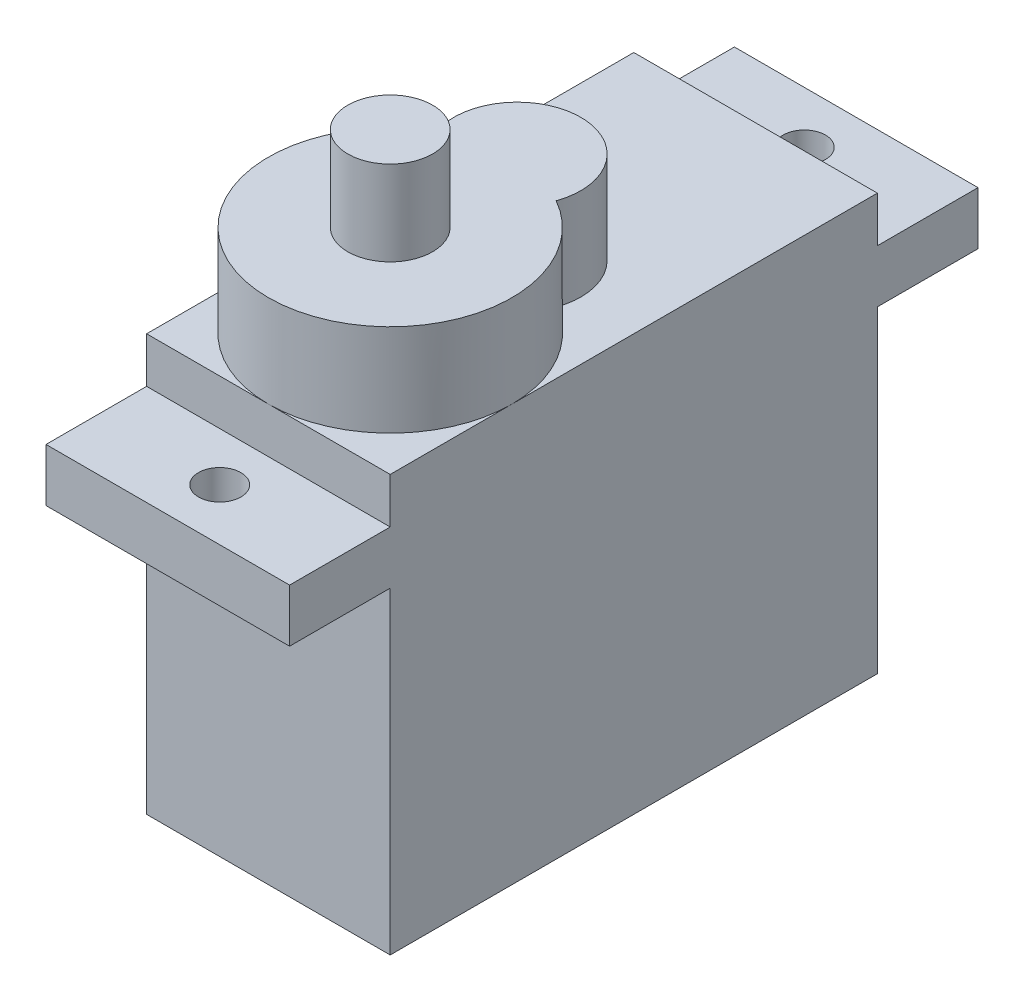
ISO-10303-21;
HEADER;
FILE_DESCRIPTION(('STEP AP214'),'2;1');
FILE_NAME('part.step','',(''),(''),'','','');
FILE_SCHEMA(('AUTOMOTIVE_DESIGN { 1 0 10303 214 1 1 1 1 }'));
ENDSEC;
DATA;
#1=APPLICATION_CONTEXT('core data for automotive mechanical design processes');
#2=APPLICATION_PROTOCOL_DEFINITION('international standard','automotive_design',2000,#1);
#3=PRODUCT_CONTEXT('',#1,'mechanical');
#4=PRODUCT('Part','Part','',(#3));
#5=PRODUCT_RELATED_PRODUCT_CATEGORY('part','',(#4));
#6=PRODUCT_DEFINITION_FORMATION('','',#4);
#7=PRODUCT_DEFINITION_CONTEXT('part definition',#1,'design');
#8=PRODUCT_DEFINITION('design','',#6,#7);
#9=PRODUCT_DEFINITION_SHAPE('','',#8);
#10=(LENGTH_UNIT() NAMED_UNIT(*) SI_UNIT(.MILLI.,.METRE.));
#11=(NAMED_UNIT(*) PLANE_ANGLE_UNIT() SI_UNIT($,.RADIAN.));
#12=(NAMED_UNIT(*) SI_UNIT($,.STERADIAN.) SOLID_ANGLE_UNIT());
#13=UNCERTAINTY_MEASURE_WITH_UNIT(LENGTH_MEASURE(1.E-05),#10,'distance_accuracy_value','');
#14=(GEOMETRIC_REPRESENTATION_CONTEXT(3) GLOBAL_UNCERTAINTY_ASSIGNED_CONTEXT((#13)) GLOBAL_UNIT_ASSIGNED_CONTEXT((#10,
#11,#12)) REPRESENTATION_CONTEXT('',''));
#15=CARTESIAN_POINT('',(0.,0.,0.));
#16=DIRECTION('',(0.,0.,1.));
#17=DIRECTION('',(1.,0.,0.));
#18=AXIS2_PLACEMENT_3D('',#15,#16,#17);
#19=CARTESIAN_POINT('',(11.5,12.15,11.5));
#20=DIRECTION('',(0.,-1.,0.));
#21=DIRECTION('',(0.,0.,-1.));
#22=AXIS2_PLACEMENT_3D('',#19,#20,#21);
#23=PLANE('',#22);
#24=CARTESIAN_POINT('',(5.75,12.15,-0.249999999999997));
#25=DIRECTION('',(0.,1.,0.));
#26=DIRECTION('',(0.,0.,1.));
#27=AXIS2_PLACEMENT_3D('',#24,#25,#26);
#28=CIRCLE('',#27,3.);
#29=CARTESIAN_POINT('',(8.58026315736373,12.15,0.744791666666667));
#30=VERTEX_POINT('',#29);
#31=CARTESIAN_POINT('',(2.91973684263626,12.15,0.74479166666667));
#32=VERTEX_POINT('',#31);
#33=EDGE_CURVE('E164',#30,#32,#28,.T.);
#34=ORIENTED_EDGE('',*,*,#33,.F.);
#35=CARTESIAN_POINT('',(5.75,12.15,5.75));
#36=DIRECTION('',(0.,1.,0.));
#37=DIRECTION('',(0.,0.,1.));
#38=AXIS2_PLACEMENT_3D('',#35,#36,#37);
#39=CIRCLE('',#38,5.75);
#40=CARTESIAN_POINT('',(11.5,12.15,5.75));
#41=VERTEX_POINT('',#40);
#42=EDGE_CURVE('E59',#41,#30,#39,.T.);
#43=ORIENTED_EDGE('',*,*,#42,.F.);
#44=DIRECTION('',(0.,0.,1.));
#45=VECTOR('',#44,1.);
#46=CARTESIAN_POINT('',(11.5,12.15,11.5));
#47=LINE('',#46,#45);
#48=CARTESIAN_POINT('',(11.5,12.15,-11.5));
#49=VERTEX_POINT('',#48);
#50=EDGE_CURVE('E185',#49,#41,#47,.T.);
#51=ORIENTED_EDGE('',*,*,#50,.F.);
#52=DIRECTION('',(-1.,0.,0.));
#53=VECTOR('',#52,1.);
#54=CARTESIAN_POINT('',(11.5,12.15,-11.5));
#55=LINE('',#54,#53);
#56=CARTESIAN_POINT('',(0.,12.15,-11.5));
#57=VERTEX_POINT('',#56);
#58=EDGE_CURVE('E243',#49,#57,#55,.T.);
#59=ORIENTED_EDGE('',*,*,#58,.T.);
#60=DIRECTION('',(0.,0.,1.));
#61=VECTOR('',#60,1.);
#62=CARTESIAN_POINT('',(0.,12.15,11.5));
#63=LINE('',#62,#61);
#64=CARTESIAN_POINT('',(0.,12.15,5.75));
#65=VERTEX_POINT('',#64);
#66=EDGE_CURVE('E209',#57,#65,#63,.T.);
#67=ORIENTED_EDGE('',*,*,#66,.T.);
#68=EDGE_CURVE('E47',#32,#65,#39,.T.);
#69=ORIENTED_EDGE('',*,*,#68,.F.);
#70=EDGE_LOOP('',(#34,#43,#51,#59,#67,#69));
#71=FACE_BOUND('',#70,.T.);
#72=ADVANCED_FACE('F36',(#71),#23,.F.);
#73=CARTESIAN_POINT('',(5.75,12.15,11.5));
#74=VERTEX_POINT('',#73);
#75=EDGE_CURVE('E11',#65,#74,#39,.T.);
#76=ORIENTED_EDGE('',*,*,#75,.F.);
#77=CARTESIAN_POINT('',(0.,12.15,11.5));
#78=VERTEX_POINT('',#77);
#79=EDGE_CURVE('E208',#65,#78,#63,.T.);
#80=ORIENTED_EDGE('',*,*,#79,.T.);
#81=DIRECTION('',(-1.,0.,0.));
#82=VECTOR('',#81,1.);
#83=CARTESIAN_POINT('',(11.5,12.15,11.5));
#84=LINE('',#83,#82);
#85=EDGE_CURVE('E239',#74,#78,#84,.T.);
#86=ORIENTED_EDGE('',*,*,#85,.F.);
#87=EDGE_LOOP('',(#76,#80,#86));
#88=FACE_BOUND('',#87,.T.);
#89=ADVANCED_FACE('F298',(#88),#23,.F.);
#90=CARTESIAN_POINT('',(11.5,7.5,-11.5));
#91=DIRECTION('',(0.,0.,1.));
#92=DIRECTION('',(0.,-1.,0.));
#93=AXIS2_PLACEMENT_3D('',#90,#91,#92);
#94=PLANE('',#93);
#95=DIRECTION('',(0.,1.,0.));
#96=VECTOR('',#95,1.);
#97=CARTESIAN_POINT('',(0.,7.5,-11.5));
#98=LINE('',#97,#96);
#99=CARTESIAN_POINT('',(0.,-7.5,-11.5));
#100=VERTEX_POINT('',#99);
#101=CARTESIAN_POINT('',(0.,7.5,-11.5));
#102=VERTEX_POINT('',#101);
#103=EDGE_CURVE('E165',#100,#102,#98,.T.);
#104=ORIENTED_EDGE('',*,*,#103,.T.);
#105=DIRECTION('',(-1.,0.,0.));
#106=VECTOR('',#105,1.);
#107=CARTESIAN_POINT('',(11.5,7.5,-11.5));
#108=LINE('',#107,#106);
#109=CARTESIAN_POINT('',(11.5,7.5,-11.5));
#110=VERTEX_POINT('',#109);
#111=EDGE_CURVE('E254',#110,#102,#108,.T.);
#112=ORIENTED_EDGE('',*,*,#111,.F.);
#113=DIRECTION('',(0.,1.,0.));
#114=VECTOR('',#113,1.);
#115=CARTESIAN_POINT('',(11.5,7.5,-11.5));
#116=LINE('',#115,#114);
#117=CARTESIAN_POINT('',(11.5,-7.5,-11.5));
#118=VERTEX_POINT('',#117);
#119=EDGE_CURVE('E172',#118,#110,#116,.T.);
#120=ORIENTED_EDGE('',*,*,#119,.F.);
#121=DIRECTION('',(-1.,0.,0.));
#122=VECTOR('',#121,1.);
#123=CARTESIAN_POINT('',(11.5,-7.5,-11.5));
#124=LINE('',#123,#122);
#125=EDGE_CURVE('E199',#118,#100,#124,.T.);
#126=ORIENTED_EDGE('',*,*,#125,.T.);
#127=EDGE_LOOP('',(#104,#112,#120,#126));
#128=FACE_BOUND('',#127,.T.);
#129=ADVANCED_FACE('F38',(#128),#94,.F.);
#130=CARTESIAN_POINT('',(11.5,7.5,-11.5));
#131=DIRECTION('',(0.,1.,0.));
#132=DIRECTION('',(0.,0.,1.));
#133=AXIS2_PLACEMENT_3D('',#130,#131,#132);
#134=PLANE('',#133);
#135=CARTESIAN_POINT('',(5.75,7.5,-13.8));
#136=DIRECTION('',(0.,1.,0.));
#137=DIRECTION('',(0.,0.,1.));
#138=AXIS2_PLACEMENT_3D('',#135,#136,#137);
#139=CIRCLE('',#138,1.);
#140=CARTESIAN_POINT('',(5.75,7.5,-12.8));
#141=VERTEX_POINT('',#140);
#142=EDGE_CURVE('E266',#141,#141,#139,.T.);
#143=ORIENTED_EDGE('',*,*,#142,.T.);
#144=EDGE_LOOP('',(#143));
#145=FACE_BOUND('',#144,.T.);
#146=DIRECTION('',(0.,0.,-1.));
#147=VECTOR('',#146,1.);
#148=CARTESIAN_POINT('',(0.,7.5,-11.5));
#149=LINE('',#148,#147);
#150=CARTESIAN_POINT('',(0.,7.5,-16.25));
#151=VERTEX_POINT('',#150);
#152=EDGE_CURVE('E168',#102,#151,#149,.T.);
#153=ORIENTED_EDGE('',*,*,#152,.T.);
#154=DIRECTION('',(-1.,0.,0.));
#155=VECTOR('',#154,1.);
#156=CARTESIAN_POINT('',(11.5,7.5,-16.25));
#157=LINE('',#156,#155);
#158=CARTESIAN_POINT('',(11.5,7.5,-16.25));
#159=VERTEX_POINT('',#158);
#160=EDGE_CURVE('E252',#159,#151,#157,.T.);
#161=ORIENTED_EDGE('',*,*,#160,.F.);
#162=DIRECTION('',(0.,0.,-1.));
#163=VECTOR('',#162,1.);
#164=CARTESIAN_POINT('',(11.5,7.5,-11.5));
#165=LINE('',#164,#163);
#166=EDGE_CURVE('E175',#110,#159,#165,.T.);
#167=ORIENTED_EDGE('',*,*,#166,.F.);
#168=ORIENTED_EDGE('',*,*,#111,.T.);
#169=EDGE_LOOP('',(#153,#161,#167,#168));
#170=FACE_BOUND('',#169,.T.);
#171=ADVANCED_FACE('F362',(#145,#170),#134,.F.);
#172=CARTESIAN_POINT('',(11.5,10.,-16.25));
#173=DIRECTION('',(0.,0.,1.));
#174=DIRECTION('',(1.,0.,0.));
#175=AXIS2_PLACEMENT_3D('',#172,#173,#174);
#176=PLANE('',#175);
#177=DIRECTION('',(0.,1.,0.));
#178=VECTOR('',#177,1.);
#179=CARTESIAN_POINT('',(0.,10.,-16.25));
#180=LINE('',#179,#178);
#181=CARTESIAN_POINT('',(0.,10.,-16.25));
#182=VERTEX_POINT('',#181);
#183=EDGE_CURVE('E202',#151,#182,#180,.T.);
#184=ORIENTED_EDGE('',*,*,#183,.T.);
#185=DIRECTION('',(-1.,0.,0.));
#186=VECTOR('',#185,1.);
#187=CARTESIAN_POINT('',(11.5,10.,-16.25));
#188=LINE('',#187,#186);
#189=CARTESIAN_POINT('',(11.5,10.,-16.25));
#190=VERTEX_POINT('',#189);
#191=EDGE_CURVE('E249',#190,#182,#188,.T.);
#192=ORIENTED_EDGE('',*,*,#191,.F.);
#193=DIRECTION('',(0.,1.,0.));
#194=VECTOR('',#193,1.);
#195=CARTESIAN_POINT('',(11.5,10.,-16.25));
#196=LINE('',#195,#194);
#197=EDGE_CURVE('E178',#159,#190,#196,.T.);
#198=ORIENTED_EDGE('',*,*,#197,.F.);
#199=ORIENTED_EDGE('',*,*,#160,.T.);
#200=EDGE_LOOP('',(#184,#192,#198,#199));
#201=FACE_BOUND('',#200,.T.);
#202=ADVANCED_FACE('F365',(#201),#176,.F.);
#203=CARTESIAN_POINT('',(11.5,10.,-11.5));
#204=DIRECTION('',(0.,-1.,0.));
#205=DIRECTION('',(0.,0.,-1.));
#206=AXIS2_PLACEMENT_3D('',#203,#204,#205);
#207=PLANE('',#206);
#208=CARTESIAN_POINT('',(5.75,10.,-13.8));
#209=DIRECTION('',(0.,1.,0.));
#210=DIRECTION('',(0.,0.,1.));
#211=AXIS2_PLACEMENT_3D('',#208,#209,#210);
#212=CIRCLE('',#211,1.);
#213=CARTESIAN_POINT('',(5.75,10.,-12.8));
#214=VERTEX_POINT('',#213);
#215=EDGE_CURVE('E270',#214,#214,#212,.T.);
#216=ORIENTED_EDGE('',*,*,#215,.F.);
#217=EDGE_LOOP('',(#216));
#218=FACE_BOUND('',#217,.T.);
#219=DIRECTION('',(0.,0.,1.));
#220=VECTOR('',#219,1.);
#221=CARTESIAN_POINT('',(0.,10.,-11.5));
#222=LINE('',#221,#220);
#223=CARTESIAN_POINT('',(0.,10.,-11.5));
#224=VERTEX_POINT('',#223);
#225=EDGE_CURVE('E204',#182,#224,#222,.T.);
#226=ORIENTED_EDGE('',*,*,#225,.T.);
#227=DIRECTION('',(-1.,0.,0.));
#228=VECTOR('',#227,1.);
#229=CARTESIAN_POINT('',(11.5,10.,-11.5));
#230=LINE('',#229,#228);
#231=CARTESIAN_POINT('',(11.5,10.,-11.5));
#232=VERTEX_POINT('',#231);
#233=EDGE_CURVE('E246',#232,#224,#230,.T.);
#234=ORIENTED_EDGE('',*,*,#233,.F.);
#235=DIRECTION('',(0.,0.,1.));
#236=VECTOR('',#235,1.);
#237=CARTESIAN_POINT('',(11.5,10.,-11.5));
#238=LINE('',#237,#236);
#239=EDGE_CURVE('E180',#190,#232,#238,.T.);
#240=ORIENTED_EDGE('',*,*,#239,.F.);
#241=ORIENTED_EDGE('',*,*,#191,.T.);
#242=EDGE_LOOP('',(#226,#234,#240,#241));
#243=FACE_BOUND('',#242,.T.);
#244=ADVANCED_FACE('F317',(#218,#243),#207,.F.);
#245=CARTESIAN_POINT('',(11.5,12.15,-11.5));
#246=DIRECTION('',(0.,0.,1.));
#247=DIRECTION('',(0.,-1.,0.));
#248=AXIS2_PLACEMENT_3D('',#245,#246,#247);
#249=PLANE('',#248);
#250=DIRECTION('',(0.,1.,0.));
#251=VECTOR('',#250,1.);
#252=CARTESIAN_POINT('',(0.,12.15,-11.5));
#253=LINE('',#252,#251);
#254=EDGE_CURVE('E206',#224,#57,#253,.T.);
#255=ORIENTED_EDGE('',*,*,#254,.T.);
#256=ORIENTED_EDGE('',*,*,#58,.F.);
#257=DIRECTION('',(0.,1.,0.));
#258=VECTOR('',#257,1.);
#259=CARTESIAN_POINT('',(11.5,12.15,-11.5));
#260=LINE('',#259,#258);
#261=EDGE_CURVE('E182',#232,#49,#260,.T.);
#262=ORIENTED_EDGE('',*,*,#261,.F.);
#263=ORIENTED_EDGE('',*,*,#233,.T.);
#264=EDGE_LOOP('',(#255,#256,#262,#263));
#265=FACE_BOUND('',#264,.T.);
#266=ADVANCED_FACE('F309',(#265),#249,.F.);
#267=EDGE_CURVE('E45',#74,#41,#39,.T.);
#268=ORIENTED_EDGE('',*,*,#267,.F.);
#269=CARTESIAN_POINT('',(11.5,12.15,11.5));
#270=VERTEX_POINT('',#269);
#271=EDGE_CURVE('E240',#270,#74,#84,.T.);
#272=ORIENTED_EDGE('',*,*,#271,.F.);
#273=EDGE_CURVE('E184',#41,#270,#47,.T.);
#274=ORIENTED_EDGE('',*,*,#273,.F.);
#275=EDGE_LOOP('',(#268,#272,#274));
#276=FACE_BOUND('',#275,.T.);
#277=ADVANCED_FACE('F300',(#276),#23,.F.);
#278=CARTESIAN_POINT('',(11.5,12.15,11.5));
#279=DIRECTION('',(0.,0.,-1.));
#280=DIRECTION('',(0.,1.,0.));
#281=AXIS2_PLACEMENT_3D('',#278,#279,#280);
#282=PLANE('',#281);
#283=DIRECTION('',(0.,-1.,0.));
#284=VECTOR('',#283,1.);
#285=CARTESIAN_POINT('',(0.,12.15,11.5));
#286=LINE('',#285,#284);
#287=CARTESIAN_POINT('',(0.,10.,11.5));
#288=VERTEX_POINT('',#287);
#289=EDGE_CURVE('E211',#78,#288,#286,.T.);
#290=ORIENTED_EDGE('',*,*,#289,.T.);
#291=DIRECTION('',(-1.,0.,0.));
#292=VECTOR('',#291,1.);
#293=CARTESIAN_POINT('',(11.5,10.,11.5));
#294=LINE('',#293,#292);
#295=CARTESIAN_POINT('',(11.5,10.,11.5));
#296=VERTEX_POINT('',#295);
#297=EDGE_CURVE('E236',#296,#288,#294,.T.);
#298=ORIENTED_EDGE('',*,*,#297,.F.);
#299=DIRECTION('',(0.,-1.,0.));
#300=VECTOR('',#299,1.);
#301=CARTESIAN_POINT('',(11.5,12.15,11.5));
#302=LINE('',#301,#300);
#303=EDGE_CURVE('E188',#270,#296,#302,.T.);
#304=ORIENTED_EDGE('',*,*,#303,.F.);
#305=ORIENTED_EDGE('',*,*,#271,.T.);
#306=ORIENTED_EDGE('',*,*,#85,.T.);
#307=EDGE_LOOP('',(#290,#298,#304,#305,#306));
#308=FACE_BOUND('',#307,.T.);
#309=ADVANCED_FACE('F308',(#308),#282,.F.);
#310=CARTESIAN_POINT('',(11.5,10.,16.25));
#311=DIRECTION('',(0.,-1.,0.));
#312=DIRECTION('',(0.,0.,-1.));
#313=AXIS2_PLACEMENT_3D('',#310,#311,#312);
#314=PLANE('',#313);
#315=CARTESIAN_POINT('',(5.75,10.,13.8));
#316=DIRECTION('',(0.,1.,0.));
#317=DIRECTION('',(0.,0.,1.));
#318=AXIS2_PLACEMENT_3D('',#315,#316,#317);
#319=CIRCLE('',#318,1.);
#320=CARTESIAN_POINT('',(5.75,10.,14.8));
#321=VERTEX_POINT('',#320);
#322=EDGE_CURVE('E273',#321,#321,#319,.T.);
#323=ORIENTED_EDGE('',*,*,#322,.F.);
#324=EDGE_LOOP('',(#323));
#325=FACE_BOUND('',#324,.T.);
#326=DIRECTION('',(0.,0.,1.));
#327=VECTOR('',#326,1.);
#328=CARTESIAN_POINT('',(0.,10.,16.25));
#329=LINE('',#328,#327);
#330=CARTESIAN_POINT('',(0.,10.,16.25));
#331=VERTEX_POINT('',#330);
#332=EDGE_CURVE('E213',#288,#331,#329,.T.);
#333=ORIENTED_EDGE('',*,*,#332,.T.);
#334=DIRECTION('',(-1.,0.,0.));
#335=VECTOR('',#334,1.);
#336=CARTESIAN_POINT('',(11.5,10.,16.25));
#337=LINE('',#336,#335);
#338=CARTESIAN_POINT('',(11.5,10.,16.25));
#339=VERTEX_POINT('',#338);
#340=EDGE_CURVE('E233',#339,#331,#337,.T.);
#341=ORIENTED_EDGE('',*,*,#340,.F.);
#342=DIRECTION('',(0.,0.,1.));
#343=VECTOR('',#342,1.);
#344=CARTESIAN_POINT('',(11.5,10.,16.25));
#345=LINE('',#344,#343);
#346=EDGE_CURVE('E190',#296,#339,#345,.T.);
#347=ORIENTED_EDGE('',*,*,#346,.F.);
#348=ORIENTED_EDGE('',*,*,#297,.T.);
#349=EDGE_LOOP('',(#333,#341,#347,#348));
#350=FACE_BOUND('',#349,.T.);
#351=ADVANCED_FACE('F315',(#325,#350),#314,.F.);
#352=CARTESIAN_POINT('',(11.5,10.,16.25));
#353=DIRECTION('',(0.,0.,-1.));
#354=DIRECTION('',(-1.,0.,0.));
#355=AXIS2_PLACEMENT_3D('',#352,#353,#354);
#356=PLANE('',#355);
#357=DIRECTION('',(0.,-1.,0.));
#358=VECTOR('',#357,1.);
#359=CARTESIAN_POINT('',(0.,10.,16.25));
#360=LINE('',#359,#358);
#361=CARTESIAN_POINT('',(0.,7.5,16.25));
#362=VERTEX_POINT('',#361);
#363=EDGE_CURVE('E215',#331,#362,#360,.T.);
#364=ORIENTED_EDGE('',*,*,#363,.T.);
#365=DIRECTION('',(-1.,0.,0.));
#366=VECTOR('',#365,1.);
#367=CARTESIAN_POINT('',(11.5,7.5,16.25));
#368=LINE('',#367,#366);
#369=CARTESIAN_POINT('',(11.5,7.5,16.25));
#370=VERTEX_POINT('',#369);
#371=EDGE_CURVE('E230',#370,#362,#368,.T.);
#372=ORIENTED_EDGE('',*,*,#371,.F.);
#373=DIRECTION('',(0.,-1.,0.));
#374=VECTOR('',#373,1.);
#375=CARTESIAN_POINT('',(11.5,10.,16.25));
#376=LINE('',#375,#374);
#377=EDGE_CURVE('E192',#339,#370,#376,.T.);
#378=ORIENTED_EDGE('',*,*,#377,.F.);
#379=ORIENTED_EDGE('',*,*,#340,.T.);
#380=EDGE_LOOP('',(#364,#372,#378,#379));
#381=FACE_BOUND('',#380,.T.);
#382=ADVANCED_FACE('F344',(#381),#356,.F.);
#383=CARTESIAN_POINT('',(11.5,7.5,16.25));
#384=DIRECTION('',(0.,1.,0.));
#385=DIRECTION('',(0.,0.,1.));
#386=AXIS2_PLACEMENT_3D('',#383,#384,#385);
#387=PLANE('',#386);
#388=CARTESIAN_POINT('',(5.75,7.5,13.8));
#389=DIRECTION('',(0.,1.,0.));
#390=DIRECTION('',(0.,0.,1.));
#391=AXIS2_PLACEMENT_3D('',#388,#389,#390);
#392=CIRCLE('',#391,1.);
#393=CARTESIAN_POINT('',(5.75,7.5,14.8));
#394=VERTEX_POINT('',#393);
#395=EDGE_CURVE('E40',#394,#394,#392,.T.);
#396=ORIENTED_EDGE('',*,*,#395,.T.);
#397=EDGE_LOOP('',(#396));
#398=FACE_BOUND('',#397,.T.);
#399=DIRECTION('',(0.,0.,-1.));
#400=VECTOR('',#399,1.);
#401=CARTESIAN_POINT('',(0.,7.5,16.25));
#402=LINE('',#401,#400);
#403=CARTESIAN_POINT('',(0.,7.5,11.5));
#404=VERTEX_POINT('',#403);
#405=EDGE_CURVE('E217',#362,#404,#402,.T.);
#406=ORIENTED_EDGE('',*,*,#405,.T.);
#407=DIRECTION('',(-1.,0.,0.));
#408=VECTOR('',#407,1.);
#409=CARTESIAN_POINT('',(11.5,7.5,11.5));
#410=LINE('',#409,#408);
#411=CARTESIAN_POINT('',(11.5,7.5,11.5));
#412=VERTEX_POINT('',#411);
#413=EDGE_CURVE('E227',#412,#404,#410,.T.);
#414=ORIENTED_EDGE('',*,*,#413,.F.);
#415=DIRECTION('',(0.,0.,-1.));
#416=VECTOR('',#415,1.);
#417=CARTESIAN_POINT('',(11.5,7.5,16.25));
#418=LINE('',#417,#416);
#419=EDGE_CURVE('E194',#370,#412,#418,.T.);
#420=ORIENTED_EDGE('',*,*,#419,.F.);
#421=ORIENTED_EDGE('',*,*,#371,.T.);
#422=EDGE_LOOP('',(#406,#414,#420,#421));
#423=FACE_BOUND('',#422,.T.);
#424=ADVANCED_FACE('F280',(#398,#423),#387,.F.);
#425=CARTESIAN_POINT('',(11.5,7.5,11.5));
#426=DIRECTION('',(0.,0.,-1.));
#427=DIRECTION('',(0.,1.,0.));
#428=AXIS2_PLACEMENT_3D('',#425,#426,#427);
#429=PLANE('',#428);
#430=DIRECTION('',(0.,-1.,0.));
#431=VECTOR('',#430,1.);
#432=CARTESIAN_POINT('',(0.,7.5,11.5));
#433=LINE('',#432,#431);
#434=CARTESIAN_POINT('',(0.,-7.5,11.5));
#435=VERTEX_POINT('',#434);
#436=EDGE_CURVE('E219',#404,#435,#433,.T.);
#437=ORIENTED_EDGE('',*,*,#436,.T.);
#438=DIRECTION('',(-1.,0.,0.));
#439=VECTOR('',#438,1.);
#440=CARTESIAN_POINT('',(11.5,-7.5,11.5));
#441=LINE('',#440,#439);
#442=CARTESIAN_POINT('',(11.5,-7.5,11.5));
#443=VERTEX_POINT('',#442);
#444=EDGE_CURVE('E224',#443,#435,#441,.T.);
#445=ORIENTED_EDGE('',*,*,#444,.F.);
#446=DIRECTION('',(0.,-1.,0.));
#447=VECTOR('',#446,1.);
#448=CARTESIAN_POINT('',(11.5,7.5,11.5));
#449=LINE('',#448,#447);
#450=EDGE_CURVE('E196',#412,#443,#449,.T.);
#451=ORIENTED_EDGE('',*,*,#450,.F.);
#452=ORIENTED_EDGE('',*,*,#413,.T.);
#453=EDGE_LOOP('',(#437,#445,#451,#452));
#454=FACE_BOUND('',#453,.T.);
#455=ADVANCED_FACE('F352',(#454),#429,.F.);
#456=CARTESIAN_POINT('',(11.5,-7.5,11.5));
#457=DIRECTION('',(0.,1.,0.));
#458=DIRECTION('',(0.,0.,1.));
#459=AXIS2_PLACEMENT_3D('',#456,#457,#458);
#460=PLANE('',#459);
#461=DIRECTION('',(0.,0.,-1.));
#462=VECTOR('',#461,1.);
#463=CARTESIAN_POINT('',(0.,-7.5,11.5));
#464=LINE('',#463,#462);
#465=EDGE_CURVE('E176',#435,#100,#464,.T.);
#466=ORIENTED_EDGE('',*,*,#465,.T.);
#467=ORIENTED_EDGE('',*,*,#125,.F.);
#468=DIRECTION('',(0.,0.,-1.));
#469=VECTOR('',#468,1.);
#470=CARTESIAN_POINT('',(11.5,-7.5,11.5));
#471=LINE('',#470,#469);
#472=EDGE_CURVE('E198',#443,#118,#471,.T.);
#473=ORIENTED_EDGE('',*,*,#472,.F.);
#474=ORIENTED_EDGE('',*,*,#444,.T.);
#475=EDGE_LOOP('',(#466,#467,#473,#474));
#476=FACE_BOUND('',#475,.T.);
#477=ADVANCED_FACE('F357',(#476),#460,.F.);
#478=CARTESIAN_POINT('',(11.5,0.,0.));
#479=DIRECTION('',(1.,0.,0.));
#480=DIRECTION('',(0.,0.,-1.));
#481=AXIS2_PLACEMENT_3D('',#478,#479,#480);
#482=PLANE('',#481);
#483=ORIENTED_EDGE('',*,*,#119,.T.);
#484=ORIENTED_EDGE('',*,*,#166,.T.);
#485=ORIENTED_EDGE('',*,*,#197,.T.);
#486=ORIENTED_EDGE('',*,*,#239,.T.);
#487=ORIENTED_EDGE('',*,*,#261,.T.);
#488=ORIENTED_EDGE('',*,*,#50,.T.);
#489=ORIENTED_EDGE('',*,*,#273,.T.);
#490=ORIENTED_EDGE('',*,*,#303,.T.);
#491=ORIENTED_EDGE('',*,*,#346,.T.);
#492=ORIENTED_EDGE('',*,*,#377,.T.);
#493=ORIENTED_EDGE('',*,*,#419,.T.);
#494=ORIENTED_EDGE('',*,*,#450,.T.);
#495=ORIENTED_EDGE('',*,*,#472,.T.);
#496=EDGE_LOOP('',(#483,#484,#485,#486,#487,#488,#489,#490,#491,#492,#493,#494,#495));
#497=FACE_BOUND('',#496,.T.);
#498=ADVANCED_FACE('F328',(#497),#482,.T.);
#499=CARTESIAN_POINT('',(0.,0.,0.));
#500=DIRECTION('',(1.,0.,0.));
#501=DIRECTION('',(0.,0.,-1.));
#502=AXIS2_PLACEMENT_3D('',#499,#500,#501);
#503=PLANE('',#502);
#504=ORIENTED_EDGE('',*,*,#103,.F.);
#505=ORIENTED_EDGE('',*,*,#465,.F.);
#506=ORIENTED_EDGE('',*,*,#436,.F.);
#507=ORIENTED_EDGE('',*,*,#405,.F.);
#508=ORIENTED_EDGE('',*,*,#363,.F.);
#509=ORIENTED_EDGE('',*,*,#332,.F.);
#510=ORIENTED_EDGE('',*,*,#289,.F.);
#511=ORIENTED_EDGE('',*,*,#79,.F.);
#512=ORIENTED_EDGE('',*,*,#66,.F.);
#513=ORIENTED_EDGE('',*,*,#254,.F.);
#514=ORIENTED_EDGE('',*,*,#225,.F.);
#515=ORIENTED_EDGE('',*,*,#183,.F.);
#516=ORIENTED_EDGE('',*,*,#152,.F.);
#517=EDGE_LOOP('',(#504,#505,#506,#507,#508,#509,#510,#511,#512,#513,#514,#515,#516));
#518=FACE_BOUND('',#517,.T.);
#519=ADVANCED_FACE('F336',(#518),#503,.F.);
#520=CARTESIAN_POINT('',(5.75,16.5,-0.249999999999997));
#521=DIRECTION('',(0.,-1.,0.));
#522=DIRECTION('',(0.,0.,-1.));
#523=AXIS2_PLACEMENT_3D('',#520,#521,#522);
#524=CYLINDRICAL_SURFACE('',#523,3.);
#525=ORIENTED_EDGE('',*,*,#33,.T.);
#526=DIRECTION('',(0.,-1.,0.));
#527=VECTOR('',#526,1.);
#528=CARTESIAN_POINT('',(2.91973684263626,16.5,0.74479166666667));
#529=LINE('',#528,#527);
#530=CARTESIAN_POINT('',(2.91973684263626,16.5,0.74479166666667));
#531=VERTEX_POINT('',#530);
#532=EDGE_CURVE('E152',#531,#32,#529,.T.);
#533=ORIENTED_EDGE('',*,*,#532,.F.);
#534=CARTESIAN_POINT('',(5.75,16.5,-0.249999999999997));
#535=DIRECTION('',(0.,1.,0.));
#536=DIRECTION('',(0.,0.,1.));
#537=AXIS2_PLACEMENT_3D('',#534,#535,#536);
#538=CIRCLE('',#537,3.);
#539=CARTESIAN_POINT('',(8.58026315736373,16.5,0.744791666666667));
#540=VERTEX_POINT('',#539);
#541=EDGE_CURVE('E158',#540,#531,#538,.T.);
#542=ORIENTED_EDGE('',*,*,#541,.F.);
#543=DIRECTION('',(0.,-1.,0.));
#544=VECTOR('',#543,1.);
#545=CARTESIAN_POINT('',(8.58026315736373,16.5,0.744791666666667));
#546=LINE('',#545,#544);
#547=EDGE_CURVE('E155',#540,#30,#546,.T.);
#548=ORIENTED_EDGE('',*,*,#547,.T.);
#549=EDGE_LOOP('',(#525,#533,#542,#548));
#550=FACE_BOUND('',#549,.T.);
#551=ADVANCED_FACE('F163',(#550),#524,.T.);
#552=CARTESIAN_POINT('',(5.75,16.5,5.75));
#553=DIRECTION('',(0.,-1.,0.));
#554=DIRECTION('',(0.,0.,-1.));
#555=AXIS2_PLACEMENT_3D('',#552,#553,#554);
#556=CYLINDRICAL_SURFACE('',#555,5.75);
#557=ORIENTED_EDGE('',*,*,#68,.T.);
#558=ORIENTED_EDGE('',*,*,#75,.T.);
#559=ORIENTED_EDGE('',*,*,#267,.T.);
#560=ORIENTED_EDGE('',*,*,#42,.T.);
#561=ORIENTED_EDGE('',*,*,#547,.F.);
#562=CARTESIAN_POINT('',(5.75,16.5,5.75));
#563=DIRECTION('',(0.,1.,0.));
#564=DIRECTION('',(0.,0.,1.));
#565=AXIS2_PLACEMENT_3D('',#562,#563,#564);
#566=CIRCLE('',#565,5.75);
#567=EDGE_CURVE('E148',#531,#540,#566,.T.);
#568=ORIENTED_EDGE('',*,*,#567,.F.);
#569=ORIENTED_EDGE('',*,*,#532,.T.);
#570=EDGE_LOOP('',(#557,#558,#559,#560,#561,#568,#569));
#571=FACE_BOUND('',#570,.T.);
#572=ADVANCED_FACE('F150',(#571),#556,.T.);
#573=CARTESIAN_POINT('',(5.75,16.5,2.75));
#574=DIRECTION('',(0.,1.,0.));
#575=DIRECTION('',(0.,0.,1.));
#576=AXIS2_PLACEMENT_3D('',#573,#574,#575);
#577=PLANE('',#576);
#578=CARTESIAN_POINT('',(5.75,16.5,5.75));
#579=DIRECTION('',(0.,1.,0.));
#580=DIRECTION('',(0.,0.,1.));
#581=AXIS2_PLACEMENT_3D('',#578,#579,#580);
#582=CIRCLE('',#581,2.);
#583=CARTESIAN_POINT('',(5.75,16.5,7.75));
#584=VERTEX_POINT('',#583);
#585=EDGE_CURVE('E262',#584,#584,#582,.T.);
#586=ORIENTED_EDGE('',*,*,#585,.F.);
#587=EDGE_LOOP('',(#586));
#588=FACE_BOUND('',#587,.T.);
#589=ORIENTED_EDGE('',*,*,#541,.T.);
#590=ORIENTED_EDGE('',*,*,#567,.T.);
#591=EDGE_LOOP('',(#589,#590));
#592=FACE_BOUND('',#591,.T.);
#593=ADVANCED_FACE('F160',(#588,#592),#577,.T.);
#594=CARTESIAN_POINT('',(5.75,20.5,5.75));
#595=DIRECTION('',(0.,-1.,0.));
#596=DIRECTION('',(0.,0.,-1.));
#597=AXIS2_PLACEMENT_3D('',#594,#595,#596);
#598=CYLINDRICAL_SURFACE('',#597,2.);
#599=CARTESIAN_POINT('',(5.75,20.5,5.75));
#600=DIRECTION('',(0.,1.,0.));
#601=DIRECTION('',(0.,0.,1.));
#602=AXIS2_PLACEMENT_3D('',#599,#600,#601);
#603=CIRCLE('',#602,2.);
#604=CARTESIAN_POINT('',(5.75,20.5,7.75));
#605=VERTEX_POINT('',#604);
#606=EDGE_CURVE('E260',#605,#605,#603,.T.);
#607=ORIENTED_EDGE('',*,*,#606,.F.);
#608=EDGE_LOOP('',(#607));
#609=FACE_BOUND('',#608,.T.);
#610=ORIENTED_EDGE('',*,*,#585,.T.);
#611=EDGE_LOOP('',(#610));
#612=FACE_BOUND('',#611,.T.);
#613=ADVANCED_FACE('F294',(#609,#612),#598,.T.);
#614=CARTESIAN_POINT('',(5.75,20.5,5.75));
#615=DIRECTION('',(0.,1.,0.));
#616=DIRECTION('',(0.,0.,1.));
#617=AXIS2_PLACEMENT_3D('',#614,#615,#616);
#618=PLANE('',#617);
#619=ORIENTED_EDGE('',*,*,#606,.T.);
#620=EDGE_LOOP('',(#619));
#621=FACE_BOUND('',#620,.T.);
#622=ADVANCED_FACE('F286',(#621),#618,.T.);
#623=CARTESIAN_POINT('',(5.75,-7.5,13.8));
#624=DIRECTION('',(0.,1.,0.));
#625=DIRECTION('',(0.,0.,1.));
#626=AXIS2_PLACEMENT_3D('',#623,#624,#625);
#627=CYLINDRICAL_SURFACE('',#626,1.);
#628=ORIENTED_EDGE('',*,*,#322,.T.);
#629=EDGE_LOOP('',(#628));
#630=FACE_BOUND('',#629,.T.);
#631=ORIENTED_EDGE('',*,*,#395,.F.);
#632=EDGE_LOOP('',(#631));
#633=FACE_BOUND('',#632,.T.);
#634=ADVANCED_FACE('F283',(#630,#633),#627,.F.);
#635=CARTESIAN_POINT('',(5.75,-7.5,-13.8));
#636=DIRECTION('',(0.,1.,0.));
#637=DIRECTION('',(0.,0.,1.));
#638=AXIS2_PLACEMENT_3D('',#635,#636,#637);
#639=CYLINDRICAL_SURFACE('',#638,1.);
#640=ORIENTED_EDGE('',*,*,#215,.T.);
#641=EDGE_LOOP('',(#640));
#642=FACE_BOUND('',#641,.T.);
#643=ORIENTED_EDGE('',*,*,#142,.F.);
#644=EDGE_LOOP('',(#643));
#645=FACE_BOUND('',#644,.T.);
#646=ADVANCED_FACE('F285',(#642,#645),#639,.F.);
#647=CLOSED_SHELL('',(#72,#89,#129,#171,#202,#244,#266,#277,#309,#351,#382,#424,#455,#477,#498,
#519,#551,#572,#593,#613,#622,#634,#646));
#648=MANIFOLD_SOLID_BREP('B2',#647);
#649=ADVANCED_BREP_SHAPE_REPRESENTATION('',(#18,#648),#14);
#650=SHAPE_DEFINITION_REPRESENTATION(#9,#649);
ENDSEC;
END-ISO-10303-21;
